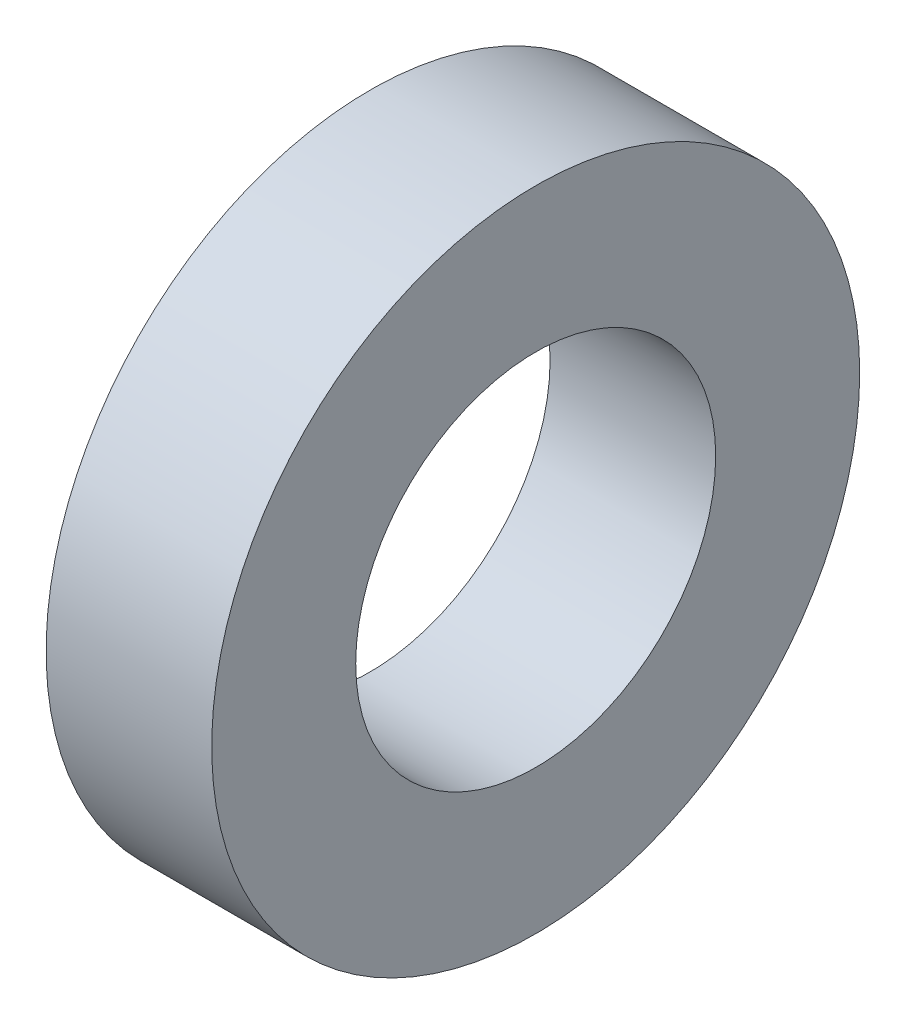
ISO-10303-21;
HEADER;
FILE_DESCRIPTION(('STEP AP214'),'2;1');
FILE_NAME('part.step','',(''),(''),'','','');
FILE_SCHEMA(('AUTOMOTIVE_DESIGN { 1 0 10303 214 1 1 1 1 }'));
ENDSEC;
DATA;
#1=APPLICATION_CONTEXT('core data for automotive mechanical design processes');
#2=APPLICATION_PROTOCOL_DEFINITION('international standard','automotive_design',2000,#1);
#3=PRODUCT_CONTEXT('',#1,'mechanical');
#4=PRODUCT('Part','Part','',(#3));
#5=PRODUCT_RELATED_PRODUCT_CATEGORY('part','',(#4));
#6=PRODUCT_DEFINITION_FORMATION('','',#4);
#7=PRODUCT_DEFINITION_CONTEXT('part definition',#1,'design');
#8=PRODUCT_DEFINITION('design','',#6,#7);
#9=PRODUCT_DEFINITION_SHAPE('','',#8);
#10=(LENGTH_UNIT() NAMED_UNIT(*) SI_UNIT(.MILLI.,.METRE.));
#11=(NAMED_UNIT(*) PLANE_ANGLE_UNIT() SI_UNIT($,.RADIAN.));
#12=(NAMED_UNIT(*) SI_UNIT($,.STERADIAN.) SOLID_ANGLE_UNIT());
#13=UNCERTAINTY_MEASURE_WITH_UNIT(LENGTH_MEASURE(1.E-05),#10,'distance_accuracy_value','');
#14=(GEOMETRIC_REPRESENTATION_CONTEXT(3) GLOBAL_UNCERTAINTY_ASSIGNED_CONTEXT((#13)) GLOBAL_UNIT_ASSIGNED_CONTEXT((#10,
#11,#12)) REPRESENTATION_CONTEXT('',''));
#15=CARTESIAN_POINT('',(0.,0.,0.));
#16=DIRECTION('',(0.,0.,1.));
#17=DIRECTION('',(1.,0.,0.));
#18=AXIS2_PLACEMENT_3D('',#15,#16,#17);
#19=CARTESIAN_POINT('',(-11.5,45.,0.));
#20=DIRECTION('',(-1.,0.,0.));
#21=DIRECTION('',(0.,0.,1.));
#22=AXIS2_PLACEMENT_3D('',#19,#20,#21);
#23=PLANE('',#22);
#24=CARTESIAN_POINT('',(-11.5,0.,0.));
#25=DIRECTION('',(1.,0.,0.));
#26=DIRECTION('',(0.,0.,-1.));
#27=AXIS2_PLACEMENT_3D('',#24,#25,#26);
#28=CIRCLE('',#27,25.);
#29=CARTESIAN_POINT('',(-11.5,0.,-25.));
#30=VERTEX_POINT('',#29);
#31=EDGE_CURVE('E10',#30,#30,#28,.T.);
#32=ORIENTED_EDGE('',*,*,#31,.T.);
#33=EDGE_LOOP('',(#32));
#34=FACE_BOUND('',#33,.T.);
#35=CARTESIAN_POINT('',(-11.5,0.,0.));
#36=DIRECTION('',(1.,0.,0.));
#37=DIRECTION('',(0.,0.,-1.));
#38=AXIS2_PLACEMENT_3D('',#35,#36,#37);
#39=CIRCLE('',#38,45.);
#40=CARTESIAN_POINT('',(-11.5,0.,-45.));
#41=VERTEX_POINT('',#40);
#42=EDGE_CURVE('E53',#41,#41,#39,.T.);
#43=ORIENTED_EDGE('',*,*,#42,.F.);
#44=EDGE_LOOP('',(#43));
#45=FACE_BOUND('',#44,.T.);
#46=ADVANCED_FACE('F39',(#34,#45),#23,.T.);
#47=CARTESIAN_POINT('',(0.,0.,0.));
#48=DIRECTION('',(1.,0.,0.));
#49=DIRECTION('',(0.,0.,-1.));
#50=AXIS2_PLACEMENT_3D('',#47,#48,#49);
#51=CYLINDRICAL_SURFACE('',#50,25.);
#52=CARTESIAN_POINT('',(11.5,0.,0.));
#53=DIRECTION('',(1.,0.,0.));
#54=DIRECTION('',(0.,0.,-1.));
#55=AXIS2_PLACEMENT_3D('',#52,#53,#54);
#56=CIRCLE('',#55,25.);
#57=CARTESIAN_POINT('',(11.5,0.,-25.));
#58=VERTEX_POINT('',#57);
#59=EDGE_CURVE('E45',#58,#58,#56,.T.);
#60=ORIENTED_EDGE('',*,*,#59,.T.);
#61=EDGE_LOOP('',(#60));
#62=FACE_BOUND('',#61,.T.);
#63=ORIENTED_EDGE('',*,*,#31,.F.);
#64=EDGE_LOOP('',(#63));
#65=FACE_BOUND('',#64,.T.);
#66=ADVANCED_FACE('F63',(#62,#65),#51,.F.);
#67=CARTESIAN_POINT('',(11.5,45.,0.));
#68=DIRECTION('',(1.,0.,0.));
#69=DIRECTION('',(0.,0.,-1.));
#70=AXIS2_PLACEMENT_3D('',#67,#68,#69);
#71=PLANE('',#70);
#72=CARTESIAN_POINT('',(11.5,0.,0.));
#73=DIRECTION('',(1.,0.,0.));
#74=DIRECTION('',(0.,0.,-1.));
#75=AXIS2_PLACEMENT_3D('',#72,#73,#74);
#76=CIRCLE('',#75,45.);
#77=CARTESIAN_POINT('',(11.5,0.,-45.));
#78=VERTEX_POINT('',#77);
#79=EDGE_CURVE('E49',#78,#78,#76,.T.);
#80=ORIENTED_EDGE('',*,*,#79,.T.);
#81=EDGE_LOOP('',(#80));
#82=FACE_BOUND('',#81,.T.);
#83=ORIENTED_EDGE('',*,*,#59,.F.);
#84=EDGE_LOOP('',(#83));
#85=FACE_BOUND('',#84,.T.);
#86=ADVANCED_FACE('F67',(#82,#85),#71,.T.);
#87=CARTESIAN_POINT('',(0.,0.,0.));
#88=DIRECTION('',(1.,0.,0.));
#89=DIRECTION('',(0.,0.,-1.));
#90=AXIS2_PLACEMENT_3D('',#87,#88,#89);
#91=CYLINDRICAL_SURFACE('',#90,45.);
#92=ORIENTED_EDGE('',*,*,#42,.T.);
#93=EDGE_LOOP('',(#92));
#94=FACE_BOUND('',#93,.T.);
#95=ORIENTED_EDGE('',*,*,#79,.F.);
#96=EDGE_LOOP('',(#95));
#97=FACE_BOUND('',#96,.T.);
#98=ADVANCED_FACE('F59',(#94,#97),#91,.T.);
#99=CLOSED_SHELL('',(#46,#66,#86,#98));
#100=MANIFOLD_SOLID_BREP('B2',#99);
#101=ADVANCED_BREP_SHAPE_REPRESENTATION('',(#18,#100),#14);
#102=SHAPE_DEFINITION_REPRESENTATION(#9,#101);
ENDSEC;
END-ISO-10303-21;
